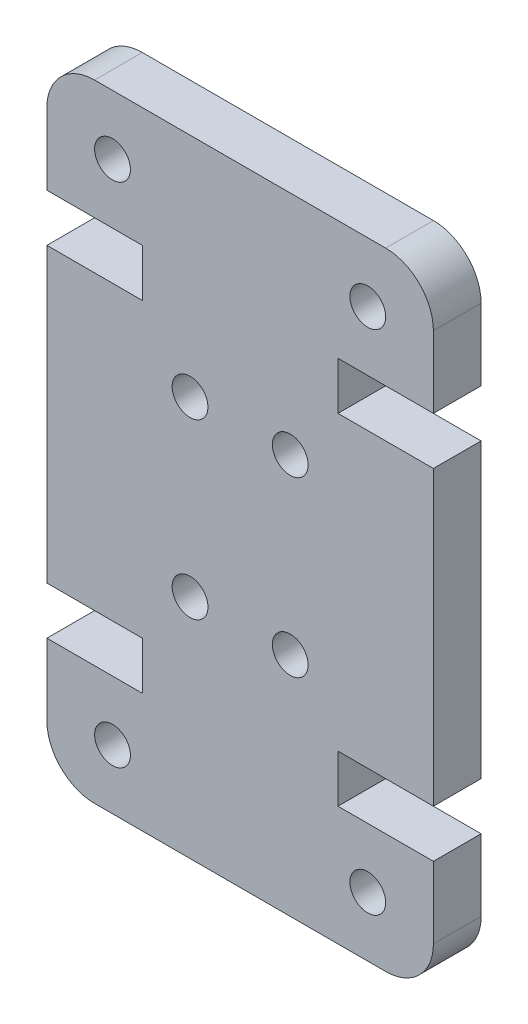
ISO-10303-21;
HEADER;
FILE_DESCRIPTION(('STEP AP214'),'2;1');
FILE_NAME('part.step','',(''),(''),'','','');
FILE_SCHEMA(('AUTOMOTIVE_DESIGN { 1 0 10303 214 1 1 1 1 }'));
ENDSEC;
DATA;
#1=APPLICATION_CONTEXT('core data for automotive mechanical design processes');
#2=APPLICATION_PROTOCOL_DEFINITION('international standard','automotive_design',2000,#1);
#3=PRODUCT_CONTEXT('',#1,'mechanical');
#4=PRODUCT('Part','Part','',(#3));
#5=PRODUCT_RELATED_PRODUCT_CATEGORY('part','',(#4));
#6=PRODUCT_DEFINITION_FORMATION('','',#4);
#7=PRODUCT_DEFINITION_CONTEXT('part definition',#1,'design');
#8=PRODUCT_DEFINITION('design','',#6,#7);
#9=PRODUCT_DEFINITION_SHAPE('','',#8);
#10=(LENGTH_UNIT() NAMED_UNIT(*) SI_UNIT(.MILLI.,.METRE.));
#11=(NAMED_UNIT(*) PLANE_ANGLE_UNIT() SI_UNIT($,.RADIAN.));
#12=(NAMED_UNIT(*) SI_UNIT($,.STERADIAN.) SOLID_ANGLE_UNIT());
#13=UNCERTAINTY_MEASURE_WITH_UNIT(LENGTH_MEASURE(1.E-05),#10,'distance_accuracy_value','');
#14=(GEOMETRIC_REPRESENTATION_CONTEXT(3) GLOBAL_UNCERTAINTY_ASSIGNED_CONTEXT((#13)) GLOBAL_UNIT_ASSIGNED_CONTEXT((#10,
#11,#12)) REPRESENTATION_CONTEXT('',''));
#15=CARTESIAN_POINT('',(0.,0.,0.));
#16=DIRECTION('',(0.,0.,1.));
#17=DIRECTION('',(1.,0.,0.));
#18=AXIS2_PLACEMENT_3D('',#15,#16,#17);
#19=CARTESIAN_POINT('',(14.2,2.,2.));
#20=DIRECTION('',(0.,0.,-1.));
#21=DIRECTION('',(-1.,0.,0.));
#22=AXIS2_PLACEMENT_3D('',#19,#20,#21);
#23=PLANE('',#22);
#24=CARTESIAN_POINT('',(6.00000000000001,9.49999999999963,2.));
#25=DIRECTION('',(0.,0.,1.));
#26=DIRECTION('',(1.,0.,0.));
#27=AXIS2_PLACEMENT_3D('',#24,#25,#26);
#28=CIRCLE('',#27,0.749999999999999);
#29=CARTESIAN_POINT('',(6.75,9.49999999999963,2.));
#30=VERTEX_POINT('',#29);
#31=EDGE_CURVE('E464',#30,#30,#28,.T.);
#32=ORIENTED_EDGE('',*,*,#31,.F.);
#33=EDGE_LOOP('',(#32));
#34=FACE_BOUND('',#33,.T.);
#35=CARTESIAN_POINT('',(10.2,16.7600000000004,2.));
#36=DIRECTION('',(0.,0.,1.));
#37=DIRECTION('',(1.,0.,0.));
#38=AXIS2_PLACEMENT_3D('',#35,#36,#37);
#39=CIRCLE('',#38,0.749999999999999);
#40=CARTESIAN_POINT('',(10.95,16.7600000000004,2.));
#41=VERTEX_POINT('',#40);
#42=EDGE_CURVE('E476',#41,#41,#39,.T.);
#43=ORIENTED_EDGE('',*,*,#42,.F.);
#44=EDGE_LOOP('',(#43));
#45=FACE_BOUND('',#44,.T.);
#46=CARTESIAN_POINT('',(2.75000000000002,23.7599999999998,2.));
#47=DIRECTION('',(0.,0.,1.));
#48=DIRECTION('',(-1.,0.,0.));
#49=AXIS2_PLACEMENT_3D('',#46,#47,#48);
#50=CIRCLE('',#49,0.749999999999999);
#51=CARTESIAN_POINT('',(2.00000000000003,23.7599999999998,2.));
#52=VERTEX_POINT('',#51);
#53=EDGE_CURVE('E488',#52,#52,#50,.T.);
#54=ORIENTED_EDGE('',*,*,#53,.F.);
#55=EDGE_LOOP('',(#54));
#56=FACE_BOUND('',#55,.T.);
#57=CARTESIAN_POINT('',(13.45,2.50000000000017,2.));
#58=DIRECTION('',(0.,0.,1.));
#59=DIRECTION('',(-1.,0.,0.));
#60=AXIS2_PLACEMENT_3D('',#57,#58,#59);
#61=CIRCLE('',#60,0.750000000000002);
#62=CARTESIAN_POINT('',(12.7,2.50000000000017,2.));
#63=VERTEX_POINT('',#62);
#64=EDGE_CURVE('E230',#63,#63,#61,.T.);
#65=ORIENTED_EDGE('',*,*,#64,.F.);
#66=EDGE_LOOP('',(#65));
#67=FACE_BOUND('',#66,.T.);
#68=CARTESIAN_POINT('',(14.2,2.,2.));
#69=DIRECTION('',(0.,0.,1.));
#70=DIRECTION('',(-1.,0.,0.));
#71=AXIS2_PLACEMENT_3D('',#68,#69,#70);
#72=CIRCLE('',#71,2.);
#73=CARTESIAN_POINT('',(14.2,0.,2.));
#74=VERTEX_POINT('',#73);
#75=CARTESIAN_POINT('',(16.2,2.,2.));
#76=VERTEX_POINT('',#75);
#77=EDGE_CURVE('E273',#74,#76,#72,.T.);
#78=ORIENTED_EDGE('',*,*,#77,.T.);
#79=DIRECTION('',(0.,1.,0.));
#80=VECTOR('',#79,1.);
#81=CARTESIAN_POINT('',(16.2,2.,2.));
#82=LINE('',#81,#80);
#83=CARTESIAN_POINT('',(16.2,4.99999999999945,2.));
#84=VERTEX_POINT('',#83);
#85=EDGE_CURVE('E141',#76,#84,#82,.T.);
#86=ORIENTED_EDGE('',*,*,#85,.T.);
#87=DIRECTION('',(-1.,0.,0.));
#88=VECTOR('',#87,1.);
#89=CARTESIAN_POINT('',(12.2,4.99999999999945,2.));
#90=LINE('',#89,#88);
#91=CARTESIAN_POINT('',(12.2,4.99999999999945,2.));
#92=VERTEX_POINT('',#91);
#93=EDGE_CURVE('E336',#84,#92,#90,.T.);
#94=ORIENTED_EDGE('',*,*,#93,.T.);
#95=DIRECTION('',(0.,1.,0.));
#96=VECTOR('',#95,1.);
#97=CARTESIAN_POINT('',(12.2,6.99999999999945,2.));
#98=LINE('',#97,#96);
#99=CARTESIAN_POINT('',(12.2,6.99999999999945,2.));
#100=VERTEX_POINT('',#99);
#101=EDGE_CURVE('E355',#92,#100,#98,.T.);
#102=ORIENTED_EDGE('',*,*,#101,.T.);
#103=DIRECTION('',(1.,0.,0.));
#104=VECTOR('',#103,1.);
#105=CARTESIAN_POINT('',(16.2,6.99999999999945,2.));
#106=LINE('',#105,#104);
#107=CARTESIAN_POINT('',(16.2,6.99999999999945,2.));
#108=VERTEX_POINT('',#107);
#109=EDGE_CURVE('E352',#100,#108,#106,.T.);
#110=ORIENTED_EDGE('',*,*,#109,.T.);
#111=DIRECTION('',(0.,1.,0.));
#112=VECTOR('',#111,1.);
#113=CARTESIAN_POINT('',(16.2,6.99999999999945,2.));
#114=LINE('',#113,#112);
#115=CARTESIAN_POINT('',(16.2,19.2600000000005,2.));
#116=VERTEX_POINT('',#115);
#117=EDGE_CURVE('E354',#108,#116,#114,.T.);
#118=ORIENTED_EDGE('',*,*,#117,.T.);
#119=DIRECTION('',(-1.,0.,0.));
#120=VECTOR('',#119,1.);
#121=CARTESIAN_POINT('',(16.2,19.2600000000005,2.));
#122=LINE('',#121,#120);
#123=CARTESIAN_POINT('',(12.2,19.2600000000005,2.));
#124=VERTEX_POINT('',#123);
#125=EDGE_CURVE('E357',#116,#124,#122,.T.);
#126=ORIENTED_EDGE('',*,*,#125,.T.);
#127=DIRECTION('',(0.,1.,0.));
#128=VECTOR('',#127,1.);
#129=CARTESIAN_POINT('',(12.2,19.2600000000005,2.));
#130=LINE('',#129,#128);
#131=CARTESIAN_POINT('',(12.2,21.2600000000005,2.));
#132=VERTEX_POINT('',#131);
#133=EDGE_CURVE('E363',#124,#132,#130,.T.);
#134=ORIENTED_EDGE('',*,*,#133,.T.);
#135=DIRECTION('',(1.,0.,0.));
#136=VECTOR('',#135,1.);
#137=CARTESIAN_POINT('',(12.2,21.2600000000005,2.));
#138=LINE('',#137,#136);
#139=CARTESIAN_POINT('',(16.2,21.2600000000005,2.));
#140=VERTEX_POINT('',#139);
#141=EDGE_CURVE('E365',#132,#140,#138,.T.);
#142=ORIENTED_EDGE('',*,*,#141,.T.);
#143=DIRECTION('',(0.,1.,0.));
#144=VECTOR('',#143,1.);
#145=CARTESIAN_POINT('',(16.2,24.26,2.));
#146=LINE('',#145,#144);
#147=CARTESIAN_POINT('',(16.2,24.26,2.));
#148=VERTEX_POINT('',#147);
#149=EDGE_CURVE('E367',#140,#148,#146,.T.);
#150=ORIENTED_EDGE('',*,*,#149,.T.);
#151=CARTESIAN_POINT('',(14.2,24.26,2.));
#152=DIRECTION('',(0.,0.,1.));
#153=DIRECTION('',(1.,0.,0.));
#154=AXIS2_PLACEMENT_3D('',#151,#152,#153);
#155=CIRCLE('',#154,2.);
#156=CARTESIAN_POINT('',(14.2,26.26,2.));
#157=VERTEX_POINT('',#156);
#158=EDGE_CURVE('E369',#148,#157,#155,.T.);
#159=ORIENTED_EDGE('',*,*,#158,.T.);
#160=DIRECTION('',(-1.,0.,0.));
#161=VECTOR('',#160,1.);
#162=CARTESIAN_POINT('',(1.99999999999999,26.26,2.));
#163=LINE('',#162,#161);
#164=CARTESIAN_POINT('',(1.99999999999999,26.26,2.));
#165=VERTEX_POINT('',#164);
#166=EDGE_CURVE('E371',#157,#165,#163,.T.);
#167=ORIENTED_EDGE('',*,*,#166,.T.);
#168=CARTESIAN_POINT('',(2.,24.26,2.));
#169=DIRECTION('',(0.,0.,1.));
#170=DIRECTION('',(-1.,0.,0.));
#171=AXIS2_PLACEMENT_3D('',#168,#169,#170);
#172=CIRCLE('',#171,2.);
#173=CARTESIAN_POINT('',(0.,24.26,2.));
#174=VERTEX_POINT('',#173);
#175=EDGE_CURVE('E373',#165,#174,#172,.T.);
#176=ORIENTED_EDGE('',*,*,#175,.T.);
#177=DIRECTION('',(0.,-1.,0.));
#178=VECTOR('',#177,1.);
#179=CARTESIAN_POINT('',(0.,24.26,2.));
#180=LINE('',#179,#178);
#181=CARTESIAN_POINT('',(0.,21.2600000000005,2.));
#182=VERTEX_POINT('',#181);
#183=EDGE_CURVE('E375',#174,#182,#180,.T.);
#184=ORIENTED_EDGE('',*,*,#183,.T.);
#185=DIRECTION('',(1.,0.,0.));
#186=VECTOR('',#185,1.);
#187=CARTESIAN_POINT('',(3.99999999999999,21.2600000000005,2.));
#188=LINE('',#187,#186);
#189=CARTESIAN_POINT('',(3.99999999999999,21.2600000000005,2.));
#190=VERTEX_POINT('',#189);
#191=EDGE_CURVE('E377',#182,#190,#188,.T.);
#192=ORIENTED_EDGE('',*,*,#191,.T.);
#193=DIRECTION('',(0.,-1.,0.));
#194=VECTOR('',#193,1.);
#195=CARTESIAN_POINT('',(4.,19.2600000000005,2.));
#196=LINE('',#195,#194);
#197=CARTESIAN_POINT('',(4.,19.2600000000005,2.));
#198=VERTEX_POINT('',#197);
#199=EDGE_CURVE('E379',#190,#198,#196,.T.);
#200=ORIENTED_EDGE('',*,*,#199,.T.);
#201=DIRECTION('',(-1.,0.,0.));
#202=VECTOR('',#201,1.);
#203=CARTESIAN_POINT('',(0.,19.2600000000005,2.));
#204=LINE('',#203,#202);
#205=CARTESIAN_POINT('',(0.,19.2600000000005,2.));
#206=VERTEX_POINT('',#205);
#207=EDGE_CURVE('E381',#198,#206,#204,.T.);
#208=ORIENTED_EDGE('',*,*,#207,.T.);
#209=DIRECTION('',(0.,-1.,0.));
#210=VECTOR('',#209,1.);
#211=CARTESIAN_POINT('',(0.,6.99999999999945,2.));
#212=LINE('',#211,#210);
#213=CARTESIAN_POINT('',(0.,6.99999999999945,2.));
#214=VERTEX_POINT('',#213);
#215=EDGE_CURVE('E383',#206,#214,#212,.T.);
#216=ORIENTED_EDGE('',*,*,#215,.T.);
#217=DIRECTION('',(1.,0.,0.));
#218=VECTOR('',#217,1.);
#219=CARTESIAN_POINT('',(0.,6.99999999999945,2.));
#220=LINE('',#219,#218);
#221=CARTESIAN_POINT('',(4.,6.99999999999945,2.));
#222=VERTEX_POINT('',#221);
#223=EDGE_CURVE('E385',#214,#222,#220,.T.);
#224=ORIENTED_EDGE('',*,*,#223,.T.);
#225=DIRECTION('',(0.,-1.,0.));
#226=VECTOR('',#225,1.);
#227=CARTESIAN_POINT('',(4.,6.99999999999945,2.));
#228=LINE('',#227,#226);
#229=CARTESIAN_POINT('',(4.,4.99999999999945,2.));
#230=VERTEX_POINT('',#229);
#231=EDGE_CURVE('E387',#222,#230,#228,.T.);
#232=ORIENTED_EDGE('',*,*,#231,.T.);
#233=DIRECTION('',(-1.,0.,0.));
#234=VECTOR('',#233,1.);
#235=CARTESIAN_POINT('',(4.,4.99999999999945,2.));
#236=LINE('',#235,#234);
#237=CARTESIAN_POINT('',(0.,4.99999999999945,2.));
#238=VERTEX_POINT('',#237);
#239=EDGE_CURVE('E208',#230,#238,#236,.T.);
#240=ORIENTED_EDGE('',*,*,#239,.T.);
#241=DIRECTION('',(0.,-1.,0.));
#242=VECTOR('',#241,1.);
#243=CARTESIAN_POINT('',(0.,2.,2.));
#244=LINE('',#243,#242);
#245=CARTESIAN_POINT('',(0.,2.,2.));
#246=VERTEX_POINT('',#245);
#247=EDGE_CURVE('E202',#238,#246,#244,.T.);
#248=ORIENTED_EDGE('',*,*,#247,.T.);
#249=CARTESIAN_POINT('',(2.,2.,2.));
#250=DIRECTION('',(0.,0.,1.));
#251=DIRECTION('',(1.,0.,0.));
#252=AXIS2_PLACEMENT_3D('',#249,#250,#251);
#253=CIRCLE('',#252,2.);
#254=CARTESIAN_POINT('',(2.,0.,2.));
#255=VERTEX_POINT('',#254);
#256=EDGE_CURVE('E206',#246,#255,#253,.T.);
#257=ORIENTED_EDGE('',*,*,#256,.T.);
#258=DIRECTION('',(1.,0.,0.));
#259=VECTOR('',#258,1.);
#260=CARTESIAN_POINT('',(2.,0.,2.));
#261=LINE('',#260,#259);
#262=EDGE_CURVE('E50',#255,#74,#261,.T.);
#263=ORIENTED_EDGE('',*,*,#262,.T.);
#264=EDGE_LOOP('',(#78,#86,#94,#102,#110,#118,#126,#134,#142,#150,#159,#167,#176,#184,#192,#200,
#208,#216,#224,#232,#240,#248,#257,#263));
#265=FACE_BOUND('',#264,.T.);
#266=CARTESIAN_POINT('',(10.2,9.49999999999963,2.));
#267=DIRECTION('',(0.,0.,1.));
#268=DIRECTION('',(-1.,0.,0.));
#269=AXIS2_PLACEMENT_3D('',#266,#267,#268);
#270=CIRCLE('',#269,0.749999999999998);
#271=CARTESIAN_POINT('',(9.44999999999999,9.49999999999963,2.));
#272=VERTEX_POINT('',#271);
#273=EDGE_CURVE('E494',#272,#272,#270,.T.);
#274=ORIENTED_EDGE('',*,*,#273,.F.);
#275=EDGE_LOOP('',(#274));
#276=FACE_BOUND('',#275,.T.);
#277=CARTESIAN_POINT('',(6.,16.7600000000004,2.));
#278=DIRECTION('',(0.,0.,1.));
#279=DIRECTION('',(-1.,0.,0.));
#280=AXIS2_PLACEMENT_3D('',#277,#278,#279);
#281=CIRCLE('',#280,0.750000000000001);
#282=CARTESIAN_POINT('',(5.25,16.7600000000004,2.));
#283=VERTEX_POINT('',#282);
#284=EDGE_CURVE('E482',#283,#283,#281,.T.);
#285=ORIENTED_EDGE('',*,*,#284,.F.);
#286=EDGE_LOOP('',(#285));
#287=FACE_BOUND('',#286,.T.);
#288=CARTESIAN_POINT('',(13.45,23.7599999999998,2.));
#289=DIRECTION('',(0.,0.,1.));
#290=DIRECTION('',(1.,0.,0.));
#291=AXIS2_PLACEMENT_3D('',#288,#289,#290);
#292=CIRCLE('',#291,0.750000000000002);
#293=CARTESIAN_POINT('',(14.2,23.7599999999998,2.));
#294=VERTEX_POINT('',#293);
#295=EDGE_CURVE('E470',#294,#294,#292,.T.);
#296=ORIENTED_EDGE('',*,*,#295,.F.);
#297=EDGE_LOOP('',(#296));
#298=FACE_BOUND('',#297,.T.);
#299=CARTESIAN_POINT('',(2.75000000000003,2.50000000000017,2.));
#300=DIRECTION('',(0.,0.,1.));
#301=DIRECTION('',(1.,0.,0.));
#302=AXIS2_PLACEMENT_3D('',#299,#300,#301);
#303=CIRCLE('',#302,0.749999999999999);
#304=CARTESIAN_POINT('',(3.50000000000003,2.50000000000017,2.));
#305=VERTEX_POINT('',#304);
#306=EDGE_CURVE('E455',#305,#305,#303,.T.);
#307=ORIENTED_EDGE('',*,*,#306,.F.);
#308=EDGE_LOOP('',(#307));
#309=FACE_BOUND('',#308,.T.);
#310=ADVANCED_FACE('F33',(#34,#45,#56,#67,#265,#276,#287,#298,#309),#23,.F.);
#311=CARTESIAN_POINT('',(14.2,2.,0.));
#312=DIRECTION('',(0.,0.,-1.));
#313=DIRECTION('',(-1.,0.,0.));
#314=AXIS2_PLACEMENT_3D('',#311,#312,#313);
#315=PLANE('',#314);
#316=CARTESIAN_POINT('',(6.00000000000001,9.49999999999963,0.));
#317=DIRECTION('',(0.,0.,1.));
#318=DIRECTION('',(1.,0.,0.));
#319=AXIS2_PLACEMENT_3D('',#316,#317,#318);
#320=CIRCLE('',#319,0.749999999999999);
#321=CARTESIAN_POINT('',(6.75,9.49999999999963,0.));
#322=VERTEX_POINT('',#321);
#323=EDGE_CURVE('E461',#322,#322,#320,.T.);
#324=ORIENTED_EDGE('',*,*,#323,.T.);
#325=EDGE_LOOP('',(#324));
#326=FACE_BOUND('',#325,.T.);
#327=CARTESIAN_POINT('',(10.2,16.7600000000004,0.));
#328=DIRECTION('',(0.,0.,1.));
#329=DIRECTION('',(1.,0.,0.));
#330=AXIS2_PLACEMENT_3D('',#327,#328,#329);
#331=CIRCLE('',#330,0.749999999999999);
#332=CARTESIAN_POINT('',(10.95,16.7600000000004,0.));
#333=VERTEX_POINT('',#332);
#334=EDGE_CURVE('E473',#333,#333,#331,.T.);
#335=ORIENTED_EDGE('',*,*,#334,.T.);
#336=EDGE_LOOP('',(#335));
#337=FACE_BOUND('',#336,.T.);
#338=CARTESIAN_POINT('',(2.75000000000002,23.7599999999998,0.));
#339=DIRECTION('',(0.,0.,1.));
#340=DIRECTION('',(-1.,0.,0.));
#341=AXIS2_PLACEMENT_3D('',#338,#339,#340);
#342=CIRCLE('',#341,0.749999999999999);
#343=CARTESIAN_POINT('',(2.00000000000003,23.7599999999998,0.));
#344=VERTEX_POINT('',#343);
#345=EDGE_CURVE('E485',#344,#344,#342,.T.);
#346=ORIENTED_EDGE('',*,*,#345,.T.);
#347=EDGE_LOOP('',(#346));
#348=FACE_BOUND('',#347,.T.);
#349=CARTESIAN_POINT('',(13.45,2.50000000000017,0.));
#350=DIRECTION('',(0.,0.,1.));
#351=DIRECTION('',(-1.,0.,0.));
#352=AXIS2_PLACEMENT_3D('',#349,#350,#351);
#353=CIRCLE('',#352,0.750000000000002);
#354=CARTESIAN_POINT('',(12.7,2.50000000000017,0.));
#355=VERTEX_POINT('',#354);
#356=EDGE_CURVE('E497',#355,#355,#353,.T.);
#357=ORIENTED_EDGE('',*,*,#356,.T.);
#358=EDGE_LOOP('',(#357));
#359=FACE_BOUND('',#358,.T.);
#360=CARTESIAN_POINT('',(14.2,2.,0.));
#361=DIRECTION('',(0.,0.,1.));
#362=DIRECTION('',(-1.,0.,0.));
#363=AXIS2_PLACEMENT_3D('',#360,#361,#362);
#364=CIRCLE('',#363,2.);
#365=CARTESIAN_POINT('',(14.2,0.,0.));
#366=VERTEX_POINT('',#365);
#367=CARTESIAN_POINT('',(16.2,2.,0.));
#368=VERTEX_POINT('',#367);
#369=EDGE_CURVE('E226',#366,#368,#364,.T.);
#370=ORIENTED_EDGE('',*,*,#369,.F.);
#371=DIRECTION('',(1.,0.,0.));
#372=VECTOR('',#371,1.);
#373=CARTESIAN_POINT('',(2.,0.,0.));
#374=LINE('',#373,#372);
#375=CARTESIAN_POINT('',(2.,0.,0.));
#376=VERTEX_POINT('',#375);
#377=EDGE_CURVE('E133',#376,#366,#374,.T.);
#378=ORIENTED_EDGE('',*,*,#377,.F.);
#379=CARTESIAN_POINT('',(2.,2.,0.));
#380=DIRECTION('',(0.,0.,1.));
#381=DIRECTION('',(1.,0.,0.));
#382=AXIS2_PLACEMENT_3D('',#379,#380,#381);
#383=CIRCLE('',#382,2.);
#384=CARTESIAN_POINT('',(0.,2.,0.));
#385=VERTEX_POINT('',#384);
#386=EDGE_CURVE('E127',#385,#376,#383,.T.);
#387=ORIENTED_EDGE('',*,*,#386,.F.);
#388=DIRECTION('',(0.,-1.,0.));
#389=VECTOR('',#388,1.);
#390=CARTESIAN_POINT('',(0.,2.,0.));
#391=LINE('',#390,#389);
#392=CARTESIAN_POINT('',(0.,4.99999999999945,0.));
#393=VERTEX_POINT('',#392);
#394=EDGE_CURVE('E216',#393,#385,#391,.T.);
#395=ORIENTED_EDGE('',*,*,#394,.F.);
#396=DIRECTION('',(-1.,0.,0.));
#397=VECTOR('',#396,1.);
#398=CARTESIAN_POINT('',(4.,4.99999999999945,0.));
#399=LINE('',#398,#397);
#400=CARTESIAN_POINT('',(4.,4.99999999999945,0.));
#401=VERTEX_POINT('',#400);
#402=EDGE_CURVE('E268',#401,#393,#399,.T.);
#403=ORIENTED_EDGE('',*,*,#402,.F.);
#404=DIRECTION('',(0.,-1.,0.));
#405=VECTOR('',#404,1.);
#406=CARTESIAN_POINT('',(4.,6.99999999999945,0.));
#407=LINE('',#406,#405);
#408=CARTESIAN_POINT('',(4.,6.99999999999945,0.));
#409=VERTEX_POINT('',#408);
#410=EDGE_CURVE('E266',#409,#401,#407,.T.);
#411=ORIENTED_EDGE('',*,*,#410,.F.);
#412=DIRECTION('',(1.,0.,0.));
#413=VECTOR('',#412,1.);
#414=CARTESIAN_POINT('',(0.,6.99999999999945,0.));
#415=LINE('',#414,#413);
#416=CARTESIAN_POINT('',(0.,6.99999999999945,0.));
#417=VERTEX_POINT('',#416);
#418=EDGE_CURVE('E264',#417,#409,#415,.T.);
#419=ORIENTED_EDGE('',*,*,#418,.F.);
#420=DIRECTION('',(0.,-1.,0.));
#421=VECTOR('',#420,1.);
#422=CARTESIAN_POINT('',(0.,6.99999999999945,0.));
#423=LINE('',#422,#421);
#424=CARTESIAN_POINT('',(0.,19.2600000000005,0.));
#425=VERTEX_POINT('',#424);
#426=EDGE_CURVE('E262',#425,#417,#423,.T.);
#427=ORIENTED_EDGE('',*,*,#426,.F.);
#428=DIRECTION('',(-1.,0.,0.));
#429=VECTOR('',#428,1.);
#430=CARTESIAN_POINT('',(0.,19.2600000000005,0.));
#431=LINE('',#430,#429);
#432=CARTESIAN_POINT('',(4.,19.2600000000005,0.));
#433=VERTEX_POINT('',#432);
#434=EDGE_CURVE('E260',#433,#425,#431,.T.);
#435=ORIENTED_EDGE('',*,*,#434,.F.);
#436=DIRECTION('',(0.,-1.,0.));
#437=VECTOR('',#436,1.);
#438=CARTESIAN_POINT('',(4.,19.2600000000005,0.));
#439=LINE('',#438,#437);
#440=CARTESIAN_POINT('',(3.99999999999999,21.2600000000005,0.));
#441=VERTEX_POINT('',#440);
#442=EDGE_CURVE('E258',#441,#433,#439,.T.);
#443=ORIENTED_EDGE('',*,*,#442,.F.);
#444=DIRECTION('',(1.,0.,0.));
#445=VECTOR('',#444,1.);
#446=CARTESIAN_POINT('',(3.99999999999999,21.2600000000005,0.));
#447=LINE('',#446,#445);
#448=CARTESIAN_POINT('',(0.,21.2600000000005,0.));
#449=VERTEX_POINT('',#448);
#450=EDGE_CURVE('E256',#449,#441,#447,.T.);
#451=ORIENTED_EDGE('',*,*,#450,.F.);
#452=DIRECTION('',(0.,-1.,0.));
#453=VECTOR('',#452,1.);
#454=CARTESIAN_POINT('',(0.,24.26,0.));
#455=LINE('',#454,#453);
#456=CARTESIAN_POINT('',(0.,24.26,0.));
#457=VERTEX_POINT('',#456);
#458=EDGE_CURVE('E254',#457,#449,#455,.T.);
#459=ORIENTED_EDGE('',*,*,#458,.F.);
#460=CARTESIAN_POINT('',(2.,24.26,0.));
#461=DIRECTION('',(0.,0.,1.));
#462=DIRECTION('',(-1.,0.,0.));
#463=AXIS2_PLACEMENT_3D('',#460,#461,#462);
#464=CIRCLE('',#463,2.);
#465=CARTESIAN_POINT('',(1.99999999999999,26.26,0.));
#466=VERTEX_POINT('',#465);
#467=EDGE_CURVE('E252',#466,#457,#464,.T.);
#468=ORIENTED_EDGE('',*,*,#467,.F.);
#469=DIRECTION('',(-1.,0.,0.));
#470=VECTOR('',#469,1.);
#471=CARTESIAN_POINT('',(1.99999999999999,26.26,0.));
#472=LINE('',#471,#470);
#473=CARTESIAN_POINT('',(14.2,26.26,0.));
#474=VERTEX_POINT('',#473);
#475=EDGE_CURVE('E250',#474,#466,#472,.T.);
#476=ORIENTED_EDGE('',*,*,#475,.F.);
#477=CARTESIAN_POINT('',(14.2,24.26,0.));
#478=DIRECTION('',(0.,0.,1.));
#479=DIRECTION('',(1.,0.,0.));
#480=AXIS2_PLACEMENT_3D('',#477,#478,#479);
#481=CIRCLE('',#480,2.);
#482=CARTESIAN_POINT('',(16.2,24.26,0.));
#483=VERTEX_POINT('',#482);
#484=EDGE_CURVE('E248',#483,#474,#481,.T.);
#485=ORIENTED_EDGE('',*,*,#484,.F.);
#486=DIRECTION('',(0.,1.,0.));
#487=VECTOR('',#486,1.);
#488=CARTESIAN_POINT('',(16.2,24.26,0.));
#489=LINE('',#488,#487);
#490=CARTESIAN_POINT('',(16.2,21.2600000000005,0.));
#491=VERTEX_POINT('',#490);
#492=EDGE_CURVE('E246',#491,#483,#489,.T.);
#493=ORIENTED_EDGE('',*,*,#492,.F.);
#494=DIRECTION('',(1.,0.,0.));
#495=VECTOR('',#494,1.);
#496=CARTESIAN_POINT('',(12.2,21.2600000000005,0.));
#497=LINE('',#496,#495);
#498=CARTESIAN_POINT('',(12.2,21.2600000000005,0.));
#499=VERTEX_POINT('',#498);
#500=EDGE_CURVE('E244',#499,#491,#497,.T.);
#501=ORIENTED_EDGE('',*,*,#500,.F.);
#502=DIRECTION('',(0.,1.,0.));
#503=VECTOR('',#502,1.);
#504=CARTESIAN_POINT('',(12.2,19.2600000000005,0.));
#505=LINE('',#504,#503);
#506=CARTESIAN_POINT('',(12.2,19.2600000000005,0.));
#507=VERTEX_POINT('',#506);
#508=EDGE_CURVE('E242',#507,#499,#505,.T.);
#509=ORIENTED_EDGE('',*,*,#508,.F.);
#510=DIRECTION('',(-1.,0.,0.));
#511=VECTOR('',#510,1.);
#512=CARTESIAN_POINT('',(16.2,19.2600000000005,0.));
#513=LINE('',#512,#511);
#514=CARTESIAN_POINT('',(16.2,19.2600000000005,0.));
#515=VERTEX_POINT('',#514);
#516=EDGE_CURVE('E240',#515,#507,#513,.T.);
#517=ORIENTED_EDGE('',*,*,#516,.F.);
#518=DIRECTION('',(0.,1.,0.));
#519=VECTOR('',#518,1.);
#520=CARTESIAN_POINT('',(16.2,6.99999999999945,0.));
#521=LINE('',#520,#519);
#522=CARTESIAN_POINT('',(16.2,6.99999999999945,0.));
#523=VERTEX_POINT('',#522);
#524=EDGE_CURVE('E238',#523,#515,#521,.T.);
#525=ORIENTED_EDGE('',*,*,#524,.F.);
#526=DIRECTION('',(1.,0.,0.));
#527=VECTOR('',#526,1.);
#528=CARTESIAN_POINT('',(16.2,6.99999999999945,0.));
#529=LINE('',#528,#527);
#530=CARTESIAN_POINT('',(12.2,6.99999999999945,0.));
#531=VERTEX_POINT('',#530);
#532=EDGE_CURVE('E236',#531,#523,#529,.T.);
#533=ORIENTED_EDGE('',*,*,#532,.F.);
#534=DIRECTION('',(0.,1.,0.));
#535=VECTOR('',#534,1.);
#536=CARTESIAN_POINT('',(12.2,6.99999999999945,0.));
#537=LINE('',#536,#535);
#538=CARTESIAN_POINT('',(12.2,4.99999999999945,0.));
#539=VERTEX_POINT('',#538);
#540=EDGE_CURVE('E234',#539,#531,#537,.T.);
#541=ORIENTED_EDGE('',*,*,#540,.F.);
#542=DIRECTION('',(-1.,0.,0.));
#543=VECTOR('',#542,1.);
#544=CARTESIAN_POINT('',(12.2,4.99999999999945,0.));
#545=LINE('',#544,#543);
#546=CARTESIAN_POINT('',(16.2,4.99999999999945,0.));
#547=VERTEX_POINT('',#546);
#548=EDGE_CURVE('E232',#547,#539,#545,.T.);
#549=ORIENTED_EDGE('',*,*,#548,.F.);
#550=DIRECTION('',(0.,1.,0.));
#551=VECTOR('',#550,1.);
#552=CARTESIAN_POINT('',(16.2,2.,0.));
#553=LINE('',#552,#551);
#554=EDGE_CURVE('E229',#368,#547,#553,.T.);
#555=ORIENTED_EDGE('',*,*,#554,.F.);
#556=EDGE_LOOP('',(#370,#378,#387,#395,#403,#411,#419,#427,#435,#443,#451,#459,#468,#476,#485,
#493,#501,#509,#517,#525,#533,#541,#549,#555));
#557=FACE_BOUND('',#556,.T.);
#558=CARTESIAN_POINT('',(10.2,9.49999999999963,0.));
#559=DIRECTION('',(0.,0.,1.));
#560=DIRECTION('',(-1.,0.,0.));
#561=AXIS2_PLACEMENT_3D('',#558,#559,#560);
#562=CIRCLE('',#561,0.749999999999998);
#563=CARTESIAN_POINT('',(9.44999999999999,9.49999999999963,0.));
#564=VERTEX_POINT('',#563);
#565=EDGE_CURVE('E491',#564,#564,#562,.T.);
#566=ORIENTED_EDGE('',*,*,#565,.T.);
#567=EDGE_LOOP('',(#566));
#568=FACE_BOUND('',#567,.T.);
#569=CARTESIAN_POINT('',(6.,16.7600000000004,0.));
#570=DIRECTION('',(0.,0.,1.));
#571=DIRECTION('',(-1.,0.,0.));
#572=AXIS2_PLACEMENT_3D('',#569,#570,#571);
#573=CIRCLE('',#572,0.750000000000001);
#574=CARTESIAN_POINT('',(5.25,16.7600000000004,0.));
#575=VERTEX_POINT('',#574);
#576=EDGE_CURVE('E479',#575,#575,#573,.T.);
#577=ORIENTED_EDGE('',*,*,#576,.T.);
#578=EDGE_LOOP('',(#577));
#579=FACE_BOUND('',#578,.T.);
#580=CARTESIAN_POINT('',(13.45,23.7599999999998,0.));
#581=DIRECTION('',(0.,0.,1.));
#582=DIRECTION('',(1.,0.,0.));
#583=AXIS2_PLACEMENT_3D('',#580,#581,#582);
#584=CIRCLE('',#583,0.750000000000002);
#585=CARTESIAN_POINT('',(14.2,23.7599999999998,0.));
#586=VERTEX_POINT('',#585);
#587=EDGE_CURVE('E467',#586,#586,#584,.T.);
#588=ORIENTED_EDGE('',*,*,#587,.T.);
#589=EDGE_LOOP('',(#588));
#590=FACE_BOUND('',#589,.T.);
#591=CARTESIAN_POINT('',(2.75000000000003,2.50000000000017,0.));
#592=DIRECTION('',(0.,0.,1.));
#593=DIRECTION('',(1.,0.,0.));
#594=AXIS2_PLACEMENT_3D('',#591,#592,#593);
#595=CIRCLE('',#594,0.749999999999999);
#596=CARTESIAN_POINT('',(3.50000000000003,2.50000000000017,0.));
#597=VERTEX_POINT('',#596);
#598=EDGE_CURVE('E458',#597,#597,#595,.T.);
#599=ORIENTED_EDGE('',*,*,#598,.T.);
#600=EDGE_LOOP('',(#599));
#601=FACE_BOUND('',#600,.T.);
#602=ADVANCED_FACE('F340',(#326,#337,#348,#359,#557,#568,#579,#590,#601),#315,.T.);
#603=CARTESIAN_POINT('',(14.2,2.,2.));
#604=DIRECTION('',(0.,0.,-1.));
#605=DIRECTION('',(-1.,0.,0.));
#606=AXIS2_PLACEMENT_3D('',#603,#604,#605);
#607=CYLINDRICAL_SURFACE('',#606,2.);
#608=ORIENTED_EDGE('',*,*,#369,.T.);
#609=DIRECTION('',(0.,0.,-1.));
#610=VECTOR('',#609,1.);
#611=CARTESIAN_POINT('',(16.2,2.,2.));
#612=LINE('',#611,#610);
#613=EDGE_CURVE('E11',#76,#368,#612,.T.);
#614=ORIENTED_EDGE('',*,*,#613,.F.);
#615=ORIENTED_EDGE('',*,*,#77,.F.);
#616=DIRECTION('',(0.,0.,-1.));
#617=VECTOR('',#616,1.);
#618=CARTESIAN_POINT('',(14.2,0.,2.));
#619=LINE('',#618,#617);
#620=EDGE_CURVE('E222',#74,#366,#619,.T.);
#621=ORIENTED_EDGE('',*,*,#620,.T.);
#622=EDGE_LOOP('',(#608,#614,#615,#621));
#623=FACE_BOUND('',#622,.T.);
#624=ADVANCED_FACE('F35',(#623),#607,.T.);
#625=CARTESIAN_POINT('',(16.2,2.,2.));
#626=DIRECTION('',(-1.,0.,0.));
#627=DIRECTION('',(0.,0.,1.));
#628=AXIS2_PLACEMENT_3D('',#625,#626,#627);
#629=PLANE('',#628);
#630=ORIENTED_EDGE('',*,*,#554,.T.);
#631=DIRECTION('',(0.,0.,-1.));
#632=VECTOR('',#631,1.);
#633=CARTESIAN_POINT('',(16.2,4.99999999999945,2.));
#634=LINE('',#633,#632);
#635=EDGE_CURVE('E42',#84,#547,#634,.T.);
#636=ORIENTED_EDGE('',*,*,#635,.F.);
#637=ORIENTED_EDGE('',*,*,#85,.F.);
#638=ORIENTED_EDGE('',*,*,#613,.T.);
#639=EDGE_LOOP('',(#630,#636,#637,#638));
#640=FACE_BOUND('',#639,.T.);
#641=ADVANCED_FACE('F762',(#640),#629,.F.);
#642=CARTESIAN_POINT('',(12.2,4.99999999999945,2.));
#643=DIRECTION('',(0.,-1.,0.));
#644=DIRECTION('',(0.,0.,-1.));
#645=AXIS2_PLACEMENT_3D('',#642,#643,#644);
#646=PLANE('',#645);
#647=ORIENTED_EDGE('',*,*,#548,.T.);
#648=DIRECTION('',(0.,0.,-1.));
#649=VECTOR('',#648,1.);
#650=CARTESIAN_POINT('',(12.2,4.99999999999945,2.));
#651=LINE('',#650,#649);
#652=EDGE_CURVE('E328',#92,#539,#651,.T.);
#653=ORIENTED_EDGE('',*,*,#652,.F.);
#654=ORIENTED_EDGE('',*,*,#93,.F.);
#655=ORIENTED_EDGE('',*,*,#635,.T.);
#656=EDGE_LOOP('',(#647,#653,#654,#655));
#657=FACE_BOUND('',#656,.T.);
#658=ADVANCED_FACE('F334',(#657),#646,.F.);
#659=CARTESIAN_POINT('',(12.2,6.99999999999945,2.));
#660=DIRECTION('',(-1.,0.,0.));
#661=DIRECTION('',(0.,0.,1.));
#662=AXIS2_PLACEMENT_3D('',#659,#660,#661);
#663=PLANE('',#662);
#664=ORIENTED_EDGE('',*,*,#540,.T.);
#665=DIRECTION('',(0.,0.,-1.));
#666=VECTOR('',#665,1.);
#667=CARTESIAN_POINT('',(12.2,6.99999999999945,2.));
#668=LINE('',#667,#666);
#669=EDGE_CURVE('E325',#100,#531,#668,.T.);
#670=ORIENTED_EDGE('',*,*,#669,.F.);
#671=ORIENTED_EDGE('',*,*,#101,.F.);
#672=ORIENTED_EDGE('',*,*,#652,.T.);
#673=EDGE_LOOP('',(#664,#670,#671,#672));
#674=FACE_BOUND('',#673,.T.);
#675=ADVANCED_FACE('F346',(#674),#663,.F.);
#676=CARTESIAN_POINT('',(16.2,6.99999999999945,2.));
#677=DIRECTION('',(0.,1.,0.));
#678=DIRECTION('',(-1.,0.,0.));
#679=AXIS2_PLACEMENT_3D('',#676,#677,#678);
#680=PLANE('',#679);
#681=ORIENTED_EDGE('',*,*,#532,.T.);
#682=DIRECTION('',(0.,0.,-1.));
#683=VECTOR('',#682,1.);
#684=CARTESIAN_POINT('',(16.2,6.99999999999945,2.));
#685=LINE('',#684,#683);
#686=EDGE_CURVE('E322',#108,#523,#685,.T.);
#687=ORIENTED_EDGE('',*,*,#686,.F.);
#688=ORIENTED_EDGE('',*,*,#109,.F.);
#689=ORIENTED_EDGE('',*,*,#669,.T.);
#690=EDGE_LOOP('',(#681,#687,#688,#689));
#691=FACE_BOUND('',#690,.T.);
#692=ADVANCED_FACE('F350',(#691),#680,.F.);
#693=CARTESIAN_POINT('',(16.2,6.99999999999945,2.));
#694=DIRECTION('',(-1.,0.,0.));
#695=DIRECTION('',(0.,0.,1.));
#696=AXIS2_PLACEMENT_3D('',#693,#694,#695);
#697=PLANE('',#696);
#698=ORIENTED_EDGE('',*,*,#524,.T.);
#699=DIRECTION('',(0.,0.,-1.));
#700=VECTOR('',#699,1.);
#701=CARTESIAN_POINT('',(16.2,19.2600000000005,2.));
#702=LINE('',#701,#700);
#703=EDGE_CURVE('E319',#116,#515,#702,.T.);
#704=ORIENTED_EDGE('',*,*,#703,.F.);
#705=ORIENTED_EDGE('',*,*,#117,.F.);
#706=ORIENTED_EDGE('',*,*,#686,.T.);
#707=EDGE_LOOP('',(#698,#704,#705,#706));
#708=FACE_BOUND('',#707,.T.);
#709=ADVANCED_FACE('F727',(#708),#697,.F.);
#710=CARTESIAN_POINT('',(16.2,19.2600000000005,2.));
#711=DIRECTION('',(0.,-1.,0.));
#712=DIRECTION('',(0.,0.,-1.));
#713=AXIS2_PLACEMENT_3D('',#710,#711,#712);
#714=PLANE('',#713);
#715=ORIENTED_EDGE('',*,*,#516,.T.);
#716=DIRECTION('',(0.,0.,-1.));
#717=VECTOR('',#716,1.);
#718=CARTESIAN_POINT('',(12.2,19.2600000000005,2.));
#719=LINE('',#718,#717);
#720=EDGE_CURVE('E316',#124,#507,#719,.T.);
#721=ORIENTED_EDGE('',*,*,#720,.F.);
#722=ORIENTED_EDGE('',*,*,#125,.F.);
#723=ORIENTED_EDGE('',*,*,#703,.T.);
#724=EDGE_LOOP('',(#715,#721,#722,#723));
#725=FACE_BOUND('',#724,.T.);
#726=ADVANCED_FACE('F717',(#725),#714,.F.);
#727=CARTESIAN_POINT('',(12.2,19.2600000000005,2.));
#728=DIRECTION('',(-1.,0.,0.));
#729=DIRECTION('',(0.,0.,1.));
#730=AXIS2_PLACEMENT_3D('',#727,#728,#729);
#731=PLANE('',#730);
#732=ORIENTED_EDGE('',*,*,#508,.T.);
#733=DIRECTION('',(0.,0.,-1.));
#734=VECTOR('',#733,1.);
#735=CARTESIAN_POINT('',(12.2,21.2600000000005,2.));
#736=LINE('',#735,#734);
#737=EDGE_CURVE('E313',#132,#499,#736,.T.);
#738=ORIENTED_EDGE('',*,*,#737,.F.);
#739=ORIENTED_EDGE('',*,*,#133,.F.);
#740=ORIENTED_EDGE('',*,*,#720,.T.);
#741=EDGE_LOOP('',(#732,#738,#739,#740));
#742=FACE_BOUND('',#741,.T.);
#743=ADVANCED_FACE('F707',(#742),#731,.F.);
#744=CARTESIAN_POINT('',(12.2,21.2600000000005,2.));
#745=DIRECTION('',(0.,1.,0.));
#746=DIRECTION('',(0.,0.,1.));
#747=AXIS2_PLACEMENT_3D('',#744,#745,#746);
#748=PLANE('',#747);
#749=ORIENTED_EDGE('',*,*,#500,.T.);
#750=DIRECTION('',(0.,0.,-1.));
#751=VECTOR('',#750,1.);
#752=CARTESIAN_POINT('',(16.2,21.2600000000005,2.));
#753=LINE('',#752,#751);
#754=EDGE_CURVE('E310',#140,#491,#753,.T.);
#755=ORIENTED_EDGE('',*,*,#754,.F.);
#756=ORIENTED_EDGE('',*,*,#141,.F.);
#757=ORIENTED_EDGE('',*,*,#737,.T.);
#758=EDGE_LOOP('',(#749,#755,#756,#757));
#759=FACE_BOUND('',#758,.T.);
#760=ADVANCED_FACE('F697',(#759),#748,.F.);
#761=CARTESIAN_POINT('',(16.2,24.26,2.));
#762=DIRECTION('',(-1.,0.,0.));
#763=DIRECTION('',(0.,0.,1.));
#764=AXIS2_PLACEMENT_3D('',#761,#762,#763);
#765=PLANE('',#764);
#766=ORIENTED_EDGE('',*,*,#492,.T.);
#767=DIRECTION('',(0.,0.,-1.));
#768=VECTOR('',#767,1.);
#769=CARTESIAN_POINT('',(16.2,24.26,2.));
#770=LINE('',#769,#768);
#771=EDGE_CURVE('E307',#148,#483,#770,.T.);
#772=ORIENTED_EDGE('',*,*,#771,.F.);
#773=ORIENTED_EDGE('',*,*,#149,.F.);
#774=ORIENTED_EDGE('',*,*,#754,.T.);
#775=EDGE_LOOP('',(#766,#772,#773,#774));
#776=FACE_BOUND('',#775,.T.);
#777=ADVANCED_FACE('F687',(#776),#765,.F.);
#778=CARTESIAN_POINT('',(14.2,24.26,2.));
#779=DIRECTION('',(0.,0.,-1.));
#780=DIRECTION('',(-1.,0.,0.));
#781=AXIS2_PLACEMENT_3D('',#778,#779,#780);
#782=CYLINDRICAL_SURFACE('',#781,2.);
#783=ORIENTED_EDGE('',*,*,#484,.T.);
#784=DIRECTION('',(0.,0.,-1.));
#785=VECTOR('',#784,1.);
#786=CARTESIAN_POINT('',(14.2,26.26,2.));
#787=LINE('',#786,#785);
#788=EDGE_CURVE('E304',#157,#474,#787,.T.);
#789=ORIENTED_EDGE('',*,*,#788,.F.);
#790=ORIENTED_EDGE('',*,*,#158,.F.);
#791=ORIENTED_EDGE('',*,*,#771,.T.);
#792=EDGE_LOOP('',(#783,#789,#790,#791));
#793=FACE_BOUND('',#792,.T.);
#794=ADVANCED_FACE('F677',(#793),#782,.T.);
#795=CARTESIAN_POINT('',(1.99999999999999,26.26,2.));
#796=DIRECTION('',(0.,-1.,0.));
#797=DIRECTION('',(0.,0.,-1.));
#798=AXIS2_PLACEMENT_3D('',#795,#796,#797);
#799=PLANE('',#798);
#800=ORIENTED_EDGE('',*,*,#475,.T.);
#801=DIRECTION('',(0.,0.,-1.));
#802=VECTOR('',#801,1.);
#803=CARTESIAN_POINT('',(1.99999999999999,26.26,2.));
#804=LINE('',#803,#802);
#805=EDGE_CURVE('E301',#165,#466,#804,.T.);
#806=ORIENTED_EDGE('',*,*,#805,.F.);
#807=ORIENTED_EDGE('',*,*,#166,.F.);
#808=ORIENTED_EDGE('',*,*,#788,.T.);
#809=EDGE_LOOP('',(#800,#806,#807,#808));
#810=FACE_BOUND('',#809,.T.);
#811=ADVANCED_FACE('F667',(#810),#799,.F.);
#812=CARTESIAN_POINT('',(2.,24.26,2.));
#813=DIRECTION('',(0.,0.,-1.));
#814=DIRECTION('',(-1.,0.,0.));
#815=AXIS2_PLACEMENT_3D('',#812,#813,#814);
#816=CYLINDRICAL_SURFACE('',#815,2.);
#817=ORIENTED_EDGE('',*,*,#467,.T.);
#818=DIRECTION('',(0.,0.,-1.));
#819=VECTOR('',#818,1.);
#820=CARTESIAN_POINT('',(0.,24.26,2.));
#821=LINE('',#820,#819);
#822=EDGE_CURVE('E298',#174,#457,#821,.T.);
#823=ORIENTED_EDGE('',*,*,#822,.F.);
#824=ORIENTED_EDGE('',*,*,#175,.F.);
#825=ORIENTED_EDGE('',*,*,#805,.T.);
#826=EDGE_LOOP('',(#817,#823,#824,#825));
#827=FACE_BOUND('',#826,.T.);
#828=ADVANCED_FACE('F657',(#827),#816,.T.);
#829=CARTESIAN_POINT('',(0.,24.26,2.));
#830=DIRECTION('',(1.,0.,0.));
#831=DIRECTION('',(0.,1.,0.));
#832=AXIS2_PLACEMENT_3D('',#829,#830,#831);
#833=PLANE('',#832);
#834=ORIENTED_EDGE('',*,*,#458,.T.);
#835=DIRECTION('',(0.,0.,-1.));
#836=VECTOR('',#835,1.);
#837=CARTESIAN_POINT('',(0.,21.2600000000005,2.));
#838=LINE('',#837,#836);
#839=EDGE_CURVE('E295',#182,#449,#838,.T.);
#840=ORIENTED_EDGE('',*,*,#839,.F.);
#841=ORIENTED_EDGE('',*,*,#183,.F.);
#842=ORIENTED_EDGE('',*,*,#822,.T.);
#843=EDGE_LOOP('',(#834,#840,#841,#842));
#844=FACE_BOUND('',#843,.T.);
#845=ADVANCED_FACE('F647',(#844),#833,.F.);
#846=CARTESIAN_POINT('',(3.99999999999999,21.2600000000005,2.));
#847=DIRECTION('',(0.,1.,0.));
#848=DIRECTION('',(-1.,0.,0.));
#849=AXIS2_PLACEMENT_3D('',#846,#847,#848);
#850=PLANE('',#849);
#851=ORIENTED_EDGE('',*,*,#450,.T.);
#852=DIRECTION('',(0.,0.,-1.));
#853=VECTOR('',#852,1.);
#854=CARTESIAN_POINT('',(3.99999999999999,21.2600000000005,2.));
#855=LINE('',#854,#853);
#856=EDGE_CURVE('E292',#190,#441,#855,.T.);
#857=ORIENTED_EDGE('',*,*,#856,.F.);
#858=ORIENTED_EDGE('',*,*,#191,.F.);
#859=ORIENTED_EDGE('',*,*,#839,.T.);
#860=EDGE_LOOP('',(#851,#857,#858,#859));
#861=FACE_BOUND('',#860,.T.);
#862=ADVANCED_FACE('F637',(#861),#850,.F.);
#863=CARTESIAN_POINT('',(4.,19.2600000000005,2.));
#864=DIRECTION('',(1.,0.,0.));
#865=DIRECTION('',(0.,1.,0.));
#866=AXIS2_PLACEMENT_3D('',#863,#864,#865);
#867=PLANE('',#866);
#868=ORIENTED_EDGE('',*,*,#442,.T.);
#869=DIRECTION('',(0.,0.,-1.));
#870=VECTOR('',#869,1.);
#871=CARTESIAN_POINT('',(4.,19.2600000000005,2.));
#872=LINE('',#871,#870);
#873=EDGE_CURVE('E289',#198,#433,#872,.T.);
#874=ORIENTED_EDGE('',*,*,#873,.F.);
#875=ORIENTED_EDGE('',*,*,#199,.F.);
#876=ORIENTED_EDGE('',*,*,#856,.T.);
#877=EDGE_LOOP('',(#868,#874,#875,#876));
#878=FACE_BOUND('',#877,.T.);
#879=ADVANCED_FACE('F627',(#878),#867,.F.);
#880=CARTESIAN_POINT('',(0.,19.2600000000005,2.));
#881=DIRECTION('',(0.,-1.,0.));
#882=DIRECTION('',(1.,0.,0.));
#883=AXIS2_PLACEMENT_3D('',#880,#881,#882);
#884=PLANE('',#883);
#885=ORIENTED_EDGE('',*,*,#434,.T.);
#886=DIRECTION('',(0.,0.,-1.));
#887=VECTOR('',#886,1.);
#888=CARTESIAN_POINT('',(0.,19.2600000000005,2.));
#889=LINE('',#888,#887);
#890=EDGE_CURVE('E286',#206,#425,#889,.T.);
#891=ORIENTED_EDGE('',*,*,#890,.F.);
#892=ORIENTED_EDGE('',*,*,#207,.F.);
#893=ORIENTED_EDGE('',*,*,#873,.T.);
#894=EDGE_LOOP('',(#885,#891,#892,#893));
#895=FACE_BOUND('',#894,.T.);
#896=ADVANCED_FACE('F617',(#895),#884,.F.);
#897=CARTESIAN_POINT('',(0.,6.99999999999945,2.));
#898=DIRECTION('',(1.,0.,0.));
#899=DIRECTION('',(0.,1.,0.));
#900=AXIS2_PLACEMENT_3D('',#897,#898,#899);
#901=PLANE('',#900);
#902=ORIENTED_EDGE('',*,*,#426,.T.);
#903=DIRECTION('',(0.,0.,-1.));
#904=VECTOR('',#903,1.);
#905=CARTESIAN_POINT('',(0.,6.99999999999945,2.));
#906=LINE('',#905,#904);
#907=EDGE_CURVE('E283',#214,#417,#906,.T.);
#908=ORIENTED_EDGE('',*,*,#907,.F.);
#909=ORIENTED_EDGE('',*,*,#215,.F.);
#910=ORIENTED_EDGE('',*,*,#890,.T.);
#911=EDGE_LOOP('',(#902,#908,#909,#910));
#912=FACE_BOUND('',#911,.T.);
#913=ADVANCED_FACE('F607',(#912),#901,.F.);
#914=CARTESIAN_POINT('',(0.,6.99999999999945,2.));
#915=DIRECTION('',(0.,1.,0.));
#916=DIRECTION('',(0.,0.,1.));
#917=AXIS2_PLACEMENT_3D('',#914,#915,#916);
#918=PLANE('',#917);
#919=ORIENTED_EDGE('',*,*,#418,.T.);
#920=DIRECTION('',(0.,0.,-1.));
#921=VECTOR('',#920,1.);
#922=CARTESIAN_POINT('',(4.,6.99999999999945,2.));
#923=LINE('',#922,#921);
#924=EDGE_CURVE('E280',#222,#409,#923,.T.);
#925=ORIENTED_EDGE('',*,*,#924,.F.);
#926=ORIENTED_EDGE('',*,*,#223,.F.);
#927=ORIENTED_EDGE('',*,*,#907,.T.);
#928=EDGE_LOOP('',(#919,#925,#926,#927));
#929=FACE_BOUND('',#928,.T.);
#930=ADVANCED_FACE('F598',(#929),#918,.F.);
#931=CARTESIAN_POINT('',(4.,6.99999999999945,2.));
#932=DIRECTION('',(1.,0.,0.));
#933=DIRECTION('',(0.,0.,-1.));
#934=AXIS2_PLACEMENT_3D('',#931,#932,#933);
#935=PLANE('',#934);
#936=ORIENTED_EDGE('',*,*,#410,.T.);
#937=DIRECTION('',(0.,0.,-1.));
#938=VECTOR('',#937,1.);
#939=CARTESIAN_POINT('',(4.,4.99999999999945,2.));
#940=LINE('',#939,#938);
#941=EDGE_CURVE('E277',#230,#401,#940,.T.);
#942=ORIENTED_EDGE('',*,*,#941,.F.);
#943=ORIENTED_EDGE('',*,*,#231,.F.);
#944=ORIENTED_EDGE('',*,*,#924,.T.);
#945=EDGE_LOOP('',(#936,#942,#943,#944));
#946=FACE_BOUND('',#945,.T.);
#947=ADVANCED_FACE('F393',(#946),#935,.F.);
#948=CARTESIAN_POINT('',(4.,4.99999999999945,2.));
#949=DIRECTION('',(0.,-1.,0.));
#950=DIRECTION('',(0.,0.,-1.));
#951=AXIS2_PLACEMENT_3D('',#948,#949,#950);
#952=PLANE('',#951);
#953=ORIENTED_EDGE('',*,*,#402,.T.);
#954=DIRECTION('',(0.,0.,-1.));
#955=VECTOR('',#954,1.);
#956=CARTESIAN_POINT('',(0.,4.99999999999945,2.));
#957=LINE('',#956,#955);
#958=EDGE_CURVE('E217',#238,#393,#957,.T.);
#959=ORIENTED_EDGE('',*,*,#958,.F.);
#960=ORIENTED_EDGE('',*,*,#239,.F.);
#961=ORIENTED_EDGE('',*,*,#941,.T.);
#962=EDGE_LOOP('',(#953,#959,#960,#961));
#963=FACE_BOUND('',#962,.T.);
#964=ADVANCED_FACE('F397',(#963),#952,.F.);
#965=CARTESIAN_POINT('',(0.,2.,2.));
#966=DIRECTION('',(1.,0.,0.));
#967=DIRECTION('',(0.,0.,-1.));
#968=AXIS2_PLACEMENT_3D('',#965,#966,#967);
#969=PLANE('',#968);
#970=ORIENTED_EDGE('',*,*,#394,.T.);
#971=DIRECTION('',(0.,0.,-1.));
#972=VECTOR('',#971,1.);
#973=CARTESIAN_POINT('',(0.,2.,2.));
#974=LINE('',#973,#972);
#975=EDGE_CURVE('E213',#246,#385,#974,.T.);
#976=ORIENTED_EDGE('',*,*,#975,.F.);
#977=ORIENTED_EDGE('',*,*,#247,.F.);
#978=ORIENTED_EDGE('',*,*,#958,.T.);
#979=EDGE_LOOP('',(#970,#976,#977,#978));
#980=FACE_BOUND('',#979,.T.);
#981=ADVANCED_FACE('F214',(#980),#969,.F.);
#982=CARTESIAN_POINT('',(2.,2.,2.));
#983=DIRECTION('',(0.,0.,-1.));
#984=DIRECTION('',(-1.,0.,0.));
#985=AXIS2_PLACEMENT_3D('',#982,#983,#984);
#986=CYLINDRICAL_SURFACE('',#985,2.);
#987=ORIENTED_EDGE('',*,*,#386,.T.);
#988=DIRECTION('',(0.,0.,-1.));
#989=VECTOR('',#988,1.);
#990=CARTESIAN_POINT('',(2.,0.,2.));
#991=LINE('',#990,#989);
#992=EDGE_CURVE('E218',#255,#376,#991,.T.);
#993=ORIENTED_EDGE('',*,*,#992,.F.);
#994=ORIENTED_EDGE('',*,*,#256,.F.);
#995=ORIENTED_EDGE('',*,*,#975,.T.);
#996=EDGE_LOOP('',(#987,#993,#994,#995));
#997=FACE_BOUND('',#996,.T.);
#998=ADVANCED_FACE('F220',(#997),#986,.T.);
#999=CARTESIAN_POINT('',(2.,0.,2.));
#1000=DIRECTION('',(0.,1.,0.));
#1001=DIRECTION('',(-1.,0.,0.));
#1002=AXIS2_PLACEMENT_3D('',#999,#1000,#1001);
#1003=PLANE('',#1002);
#1004=ORIENTED_EDGE('',*,*,#377,.T.);
#1005=ORIENTED_EDGE('',*,*,#620,.F.);
#1006=ORIENTED_EDGE('',*,*,#262,.F.);
#1007=ORIENTED_EDGE('',*,*,#992,.T.);
#1008=EDGE_LOOP('',(#1004,#1005,#1006,#1007));
#1009=FACE_BOUND('',#1008,.T.);
#1010=ADVANCED_FACE('F401',(#1009),#1003,.F.);
#1011=CARTESIAN_POINT('',(13.45,2.50000000000017,2.));
#1012=DIRECTION('',(0.,0.,-1.));
#1013=DIRECTION('',(-1.,0.,0.));
#1014=AXIS2_PLACEMENT_3D('',#1011,#1012,#1013);
#1015=CYLINDRICAL_SURFACE('',#1014,0.750000000000002);
#1016=ORIENTED_EDGE('',*,*,#64,.T.);
#1017=EDGE_LOOP('',(#1016));
#1018=FACE_BOUND('',#1017,.T.);
#1019=ORIENTED_EDGE('',*,*,#356,.F.);
#1020=EDGE_LOOP('',(#1019));
#1021=FACE_BOUND('',#1020,.T.);
#1022=ADVANCED_FACE('F403',(#1018,#1021),#1015,.F.);
#1023=CARTESIAN_POINT('',(10.2,9.49999999999963,2.));
#1024=DIRECTION('',(0.,0.,-1.));
#1025=DIRECTION('',(-1.,0.,0.));
#1026=AXIS2_PLACEMENT_3D('',#1023,#1024,#1025);
#1027=CYLINDRICAL_SURFACE('',#1026,0.749999999999998);
#1028=ORIENTED_EDGE('',*,*,#273,.T.);
#1029=EDGE_LOOP('',(#1028));
#1030=FACE_BOUND('',#1029,.T.);
#1031=ORIENTED_EDGE('',*,*,#565,.F.);
#1032=EDGE_LOOP('',(#1031));
#1033=FACE_BOUND('',#1032,.T.);
#1034=ADVANCED_FACE('F409',(#1030,#1033),#1027,.F.);
#1035=CARTESIAN_POINT('',(2.75000000000002,23.7599999999998,2.));
#1036=DIRECTION('',(0.,0.,-1.));
#1037=DIRECTION('',(-1.,0.,0.));
#1038=AXIS2_PLACEMENT_3D('',#1035,#1036,#1037);
#1039=CYLINDRICAL_SURFACE('',#1038,0.749999999999999);
#1040=ORIENTED_EDGE('',*,*,#53,.T.);
#1041=EDGE_LOOP('',(#1040));
#1042=FACE_BOUND('',#1041,.T.);
#1043=ORIENTED_EDGE('',*,*,#345,.F.);
#1044=EDGE_LOOP('',(#1043));
#1045=FACE_BOUND('',#1044,.T.);
#1046=ADVANCED_FACE('F426',(#1042,#1045),#1039,.F.);
#1047=CARTESIAN_POINT('',(6.,16.7600000000004,2.));
#1048=DIRECTION('',(0.,0.,-1.));
#1049=DIRECTION('',(-1.,0.,0.));
#1050=AXIS2_PLACEMENT_3D('',#1047,#1048,#1049);
#1051=CYLINDRICAL_SURFACE('',#1050,0.750000000000001);
#1052=ORIENTED_EDGE('',*,*,#284,.T.);
#1053=EDGE_LOOP('',(#1052));
#1054=FACE_BOUND('',#1053,.T.);
#1055=ORIENTED_EDGE('',*,*,#576,.F.);
#1056=EDGE_LOOP('',(#1055));
#1057=FACE_BOUND('',#1056,.T.);
#1058=ADVANCED_FACE('F430',(#1054,#1057),#1051,.F.);
#1059=CARTESIAN_POINT('',(10.2,16.7600000000004,2.));
#1060=DIRECTION('',(0.,0.,-1.));
#1061=DIRECTION('',(-1.,0.,0.));
#1062=AXIS2_PLACEMENT_3D('',#1059,#1060,#1061);
#1063=CYLINDRICAL_SURFACE('',#1062,0.749999999999999);
#1064=ORIENTED_EDGE('',*,*,#42,.T.);
#1065=EDGE_LOOP('',(#1064));
#1066=FACE_BOUND('',#1065,.T.);
#1067=ORIENTED_EDGE('',*,*,#334,.F.);
#1068=EDGE_LOOP('',(#1067));
#1069=FACE_BOUND('',#1068,.T.);
#1070=ADVANCED_FACE('F434',(#1066,#1069),#1063,.F.);
#1071=CARTESIAN_POINT('',(13.45,23.7599999999998,2.));
#1072=DIRECTION('',(0.,0.,-1.));
#1073=DIRECTION('',(-1.,0.,0.));
#1074=AXIS2_PLACEMENT_3D('',#1071,#1072,#1073);
#1075=CYLINDRICAL_SURFACE('',#1074,0.750000000000002);
#1076=ORIENTED_EDGE('',*,*,#295,.T.);
#1077=EDGE_LOOP('',(#1076));
#1078=FACE_BOUND('',#1077,.T.);
#1079=ORIENTED_EDGE('',*,*,#587,.F.);
#1080=EDGE_LOOP('',(#1079));
#1081=FACE_BOUND('',#1080,.T.);
#1082=ADVANCED_FACE('F438',(#1078,#1081),#1075,.F.);
#1083=CARTESIAN_POINT('',(6.00000000000001,9.49999999999963,2.));
#1084=DIRECTION('',(0.,0.,-1.));
#1085=DIRECTION('',(-1.,0.,0.));
#1086=AXIS2_PLACEMENT_3D('',#1083,#1084,#1085);
#1087=CYLINDRICAL_SURFACE('',#1086,0.749999999999999);
#1088=ORIENTED_EDGE('',*,*,#31,.T.);
#1089=EDGE_LOOP('',(#1088));
#1090=FACE_BOUND('',#1089,.T.);
#1091=ORIENTED_EDGE('',*,*,#323,.F.);
#1092=EDGE_LOOP('',(#1091));
#1093=FACE_BOUND('',#1092,.T.);
#1094=ADVANCED_FACE('F442',(#1090,#1093),#1087,.F.);
#1095=CARTESIAN_POINT('',(2.75000000000003,2.50000000000017,2.));
#1096=DIRECTION('',(0.,0.,-1.));
#1097=DIRECTION('',(-1.,0.,0.));
#1098=AXIS2_PLACEMENT_3D('',#1095,#1096,#1097);
#1099=CYLINDRICAL_SURFACE('',#1098,0.749999999999999);
#1100=ORIENTED_EDGE('',*,*,#306,.T.);
#1101=EDGE_LOOP('',(#1100));
#1102=FACE_BOUND('',#1101,.T.);
#1103=ORIENTED_EDGE('',*,*,#598,.F.);
#1104=EDGE_LOOP('',(#1103));
#1105=FACE_BOUND('',#1104,.T.);
#1106=ADVANCED_FACE('F446',(#1102,#1105),#1099,.F.);
#1107=CLOSED_SHELL('',(#310,#602,#624,#641,#658,#675,#692,#709,#726,#743,#760,#777,#794,#811,
#828,#845,#862,#879,#896,#913,#930,#947,#964,#981,#998,#1010,#1022,#1034,#1046,#1058,#1070,
#1082,#1094,#1106));
#1108=MANIFOLD_SOLID_BREP('B2',#1107);
#1109=ADVANCED_BREP_SHAPE_REPRESENTATION('',(#18,#1108),#14);
#1110=SHAPE_DEFINITION_REPRESENTATION(#9,#1109);
ENDSEC;
END-ISO-10303-21;
